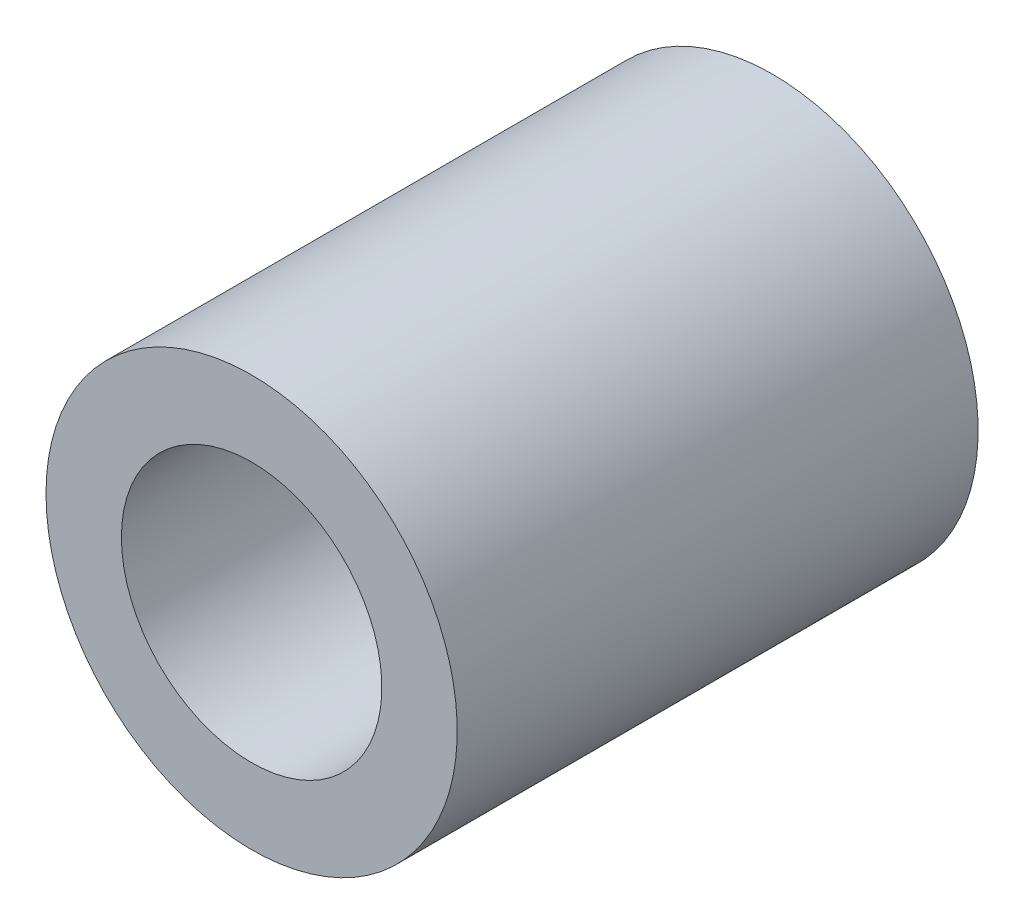
ISO-10303-21;
HEADER;
FILE_DESCRIPTION(('STEP AP214'),'2;1');
FILE_NAME('part.step','',(''),(''),'','','');
FILE_SCHEMA(('AUTOMOTIVE_DESIGN { 1 0 10303 214 1 1 1 1 }'));
ENDSEC;
DATA;
#1=APPLICATION_CONTEXT('core data for automotive mechanical design processes');
#2=APPLICATION_PROTOCOL_DEFINITION('international standard','automotive_design',2000,#1);
#3=PRODUCT_CONTEXT('',#1,'mechanical');
#4=PRODUCT('Part','Part','',(#3));
#5=PRODUCT_RELATED_PRODUCT_CATEGORY('part','',(#4));
#6=PRODUCT_DEFINITION_FORMATION('','',#4);
#7=PRODUCT_DEFINITION_CONTEXT('part definition',#1,'design');
#8=PRODUCT_DEFINITION('design','',#6,#7);
#9=PRODUCT_DEFINITION_SHAPE('','',#8);
#10=(LENGTH_UNIT() NAMED_UNIT(*) SI_UNIT(.MILLI.,.METRE.));
#11=(NAMED_UNIT(*) PLANE_ANGLE_UNIT() SI_UNIT($,.RADIAN.));
#12=(NAMED_UNIT(*) SI_UNIT($,.STERADIAN.) SOLID_ANGLE_UNIT());
#13=UNCERTAINTY_MEASURE_WITH_UNIT(LENGTH_MEASURE(1.E-05),#10,'distance_accuracy_value','');
#14=(GEOMETRIC_REPRESENTATION_CONTEXT(3) GLOBAL_UNCERTAINTY_ASSIGNED_CONTEXT((#13)) GLOBAL_UNIT_ASSIGNED_CONTEXT((#10,
#11,#12)) REPRESENTATION_CONTEXT('',''));
#15=CARTESIAN_POINT('',(0.,0.,0.));
#16=DIRECTION('',(0.,0.,1.));
#17=DIRECTION('',(1.,0.,0.));
#18=AXIS2_PLACEMENT_3D('',#15,#16,#17);
#19=CARTESIAN_POINT('',(0.,0.,7.6));
#20=DIRECTION('',(0.,0.,1.));
#21=DIRECTION('',(1.,0.,0.));
#22=AXIS2_PLACEMENT_3D('',#19,#20,#21);
#23=PLANE('',#22);
#24=CARTESIAN_POINT('',(0.,0.,7.6));
#25=DIRECTION('',(0.,0.,1.));
#26=DIRECTION('',(1.,0.,0.));
#27=AXIS2_PLACEMENT_3D('',#24,#25,#26);
#28=CIRCLE('',#27,3.);
#29=CARTESIAN_POINT('',(-3.,0.,7.6));
#30=VERTEX_POINT('',#29);
#31=EDGE_CURVE('E10',#30,#30,#28,.T.);
#32=ORIENTED_EDGE('',*,*,#31,.T.);
#33=EDGE_LOOP('',(#32));
#34=FACE_BOUND('',#33,.T.);
#35=CARTESIAN_POINT('',(0.,0.,7.6));
#36=DIRECTION('',(0.,0.,1.));
#37=DIRECTION('',(1.,0.,0.));
#38=AXIS2_PLACEMENT_3D('',#35,#36,#37);
#39=CIRCLE('',#38,1.9);
#40=CARTESIAN_POINT('',(-1.9,0.,7.6));
#41=VERTEX_POINT('',#40);
#42=EDGE_CURVE('E39',#41,#41,#39,.T.);
#43=ORIENTED_EDGE('',*,*,#42,.F.);
#44=EDGE_LOOP('',(#43));
#45=FACE_BOUND('',#44,.T.);
#46=ADVANCED_FACE('F28',(#34,#45),#23,.T.);
#47=CARTESIAN_POINT('',(0.,0.,0.));
#48=DIRECTION('',(0.,0.,1.));
#49=DIRECTION('',(1.,0.,0.));
#50=AXIS2_PLACEMENT_3D('',#47,#48,#49);
#51=PLANE('',#50);
#52=CARTESIAN_POINT('',(0.,0.,0.));
#53=DIRECTION('',(0.,0.,1.));
#54=DIRECTION('',(1.,0.,0.));
#55=AXIS2_PLACEMENT_3D('',#52,#53,#54);
#56=CIRCLE('',#55,3.);
#57=CARTESIAN_POINT('',(-3.,0.,0.));
#58=VERTEX_POINT('',#57);
#59=EDGE_CURVE('E32',#58,#58,#56,.T.);
#60=ORIENTED_EDGE('',*,*,#59,.F.);
#61=EDGE_LOOP('',(#60));
#62=FACE_BOUND('',#61,.T.);
#63=CARTESIAN_POINT('',(0.,0.,0.));
#64=DIRECTION('',(0.,0.,1.));
#65=DIRECTION('',(1.,0.,0.));
#66=AXIS2_PLACEMENT_3D('',#63,#64,#65);
#67=CIRCLE('',#66,1.9);
#68=CARTESIAN_POINT('',(-1.9,0.,0.));
#69=VERTEX_POINT('',#68);
#70=EDGE_CURVE('E41',#69,#69,#67,.T.);
#71=ORIENTED_EDGE('',*,*,#70,.T.);
#72=EDGE_LOOP('',(#71));
#73=FACE_BOUND('',#72,.T.);
#74=ADVANCED_FACE('F51',(#62,#73),#51,.F.);
#75=CARTESIAN_POINT('',(0.,0.,7.6));
#76=DIRECTION('',(0.,0.,-1.));
#77=DIRECTION('',(-1.,0.,0.));
#78=AXIS2_PLACEMENT_3D('',#75,#76,#77);
#79=CYLINDRICAL_SURFACE('',#78,3.);
#80=CARTESIAN_POINT('',(-3.,0.,7.6));
#81=CARTESIAN_POINT('',(-3.,0.,7.52083333333333));
#82=CARTESIAN_POINT('',(-3.,0.,7.44166666666667));
#83=CARTESIAN_POINT('',(-3.,0.,7.28333333333333));
#84=CARTESIAN_POINT('',(-3.,0.,7.20416666666667));
#85=CARTESIAN_POINT('',(-3.,0.,7.04583333333333));
#86=CARTESIAN_POINT('',(-3.,0.,6.96666666666667));
#87=CARTESIAN_POINT('',(-3.,0.,6.80833333333333));
#88=CARTESIAN_POINT('',(-3.,0.,6.72916666666667));
#89=CARTESIAN_POINT('',(-3.,0.,6.57083333333333));
#90=CARTESIAN_POINT('',(-3.,0.,6.49166666666667));
#91=CARTESIAN_POINT('',(-3.,0.,6.33333333333333));
#92=CARTESIAN_POINT('',(-3.,0.,6.25416666666667));
#93=CARTESIAN_POINT('',(-3.,0.,6.09583333333333));
#94=CARTESIAN_POINT('',(-3.,0.,6.01666666666667));
#95=CARTESIAN_POINT('',(-3.,0.,5.85833333333333));
#96=CARTESIAN_POINT('',(-3.,0.,5.77916666666667));
#97=CARTESIAN_POINT('',(-3.,0.,5.62083333333333));
#98=CARTESIAN_POINT('',(-3.,0.,5.54166666666667));
#99=CARTESIAN_POINT('',(-3.,0.,5.38333333333333));
#100=CARTESIAN_POINT('',(-3.,0.,5.30416666666667));
#101=CARTESIAN_POINT('',(-3.,0.,5.14583333333333));
#102=CARTESIAN_POINT('',(-3.,0.,5.06666666666667));
#103=CARTESIAN_POINT('',(-3.,0.,4.90833333333333));
#104=CARTESIAN_POINT('',(-3.,0.,4.82916666666667));
#105=CARTESIAN_POINT('',(-3.,0.,4.67083333333333));
#106=CARTESIAN_POINT('',(-3.,0.,4.59166666666667));
#107=CARTESIAN_POINT('',(-3.,0.,4.43333333333333));
#108=CARTESIAN_POINT('',(-3.,0.,4.35416666666667));
#109=CARTESIAN_POINT('',(-3.,0.,4.19583333333333));
#110=CARTESIAN_POINT('',(-3.,0.,4.11666666666667));
#111=CARTESIAN_POINT('',(-3.,0.,3.95833333333333));
#112=CARTESIAN_POINT('',(-3.,0.,3.87916666666667));
#113=CARTESIAN_POINT('',(-3.,0.,3.72083333333333));
#114=CARTESIAN_POINT('',(-3.,0.,3.64166666666667));
#115=CARTESIAN_POINT('',(-3.,0.,3.48333333333333));
#116=CARTESIAN_POINT('',(-3.,0.,3.40416666666667));
#117=CARTESIAN_POINT('',(-3.,0.,3.24583333333333));
#118=CARTESIAN_POINT('',(-3.,0.,3.16666666666667));
#119=CARTESIAN_POINT('',(-3.,0.,3.00833333333333));
#120=CARTESIAN_POINT('',(-3.,0.,2.92916666666667));
#121=CARTESIAN_POINT('',(-3.,0.,2.77083333333333));
#122=CARTESIAN_POINT('',(-3.,0.,2.69166666666667));
#123=CARTESIAN_POINT('',(-3.,0.,2.53333333333333));
#124=CARTESIAN_POINT('',(-3.,0.,2.45416666666667));
#125=CARTESIAN_POINT('',(-3.,0.,2.29583333333333));
#126=CARTESIAN_POINT('',(-3.,0.,2.21666666666667));
#127=CARTESIAN_POINT('',(-3.,0.,2.05833333333333));
#128=CARTESIAN_POINT('',(-3.,0.,1.97916666666667));
#129=CARTESIAN_POINT('',(-3.,0.,1.82083333333333));
#130=CARTESIAN_POINT('',(-3.,0.,1.74166666666667));
#131=CARTESIAN_POINT('',(-3.,0.,1.58333333333333));
#132=CARTESIAN_POINT('',(-3.,0.,1.50416666666667));
#133=CARTESIAN_POINT('',(-3.,0.,1.34583333333333));
#134=CARTESIAN_POINT('',(-3.,0.,1.26666666666667));
#135=CARTESIAN_POINT('',(-3.,0.,1.10833333333333));
#136=CARTESIAN_POINT('',(-3.,0.,1.02916666666667));
#137=CARTESIAN_POINT('',(-3.,0.,0.870833333333333));
#138=CARTESIAN_POINT('',(-3.,0.,0.791666666666667));
#139=CARTESIAN_POINT('',(-3.,0.,0.633333333333333));
#140=CARTESIAN_POINT('',(-3.,0.,0.554166666666666));
#141=CARTESIAN_POINT('',(-3.,0.,0.395833333333333));
#142=CARTESIAN_POINT('',(-3.,0.,0.316666666666667));
#143=CARTESIAN_POINT('',(-3.,0.,0.158333333333333));
#144=CARTESIAN_POINT('',(-3.,0.,0.0791666666666665));
#145=CARTESIAN_POINT('',(-3.,0.,0.));
#146=B_SPLINE_CURVE_WITH_KNOTS('',3,(#80,#81,#82,#83,#84,#85,#86,#87,#88,#89,#90,#91,#92,#93,
#94,#95,#96,#97,#98,#99,#100,#101,#102,#103,#104,#105,#106,#107,#108,#109,#110,#111,#112,#113,
#114,#115,#116,#117,#118,#119,#120,#121,#122,#123,#124,#125,#126,#127,#128,#129,#130,#131,#132,
#133,#134,#135,#136,#137,#138,#139,#140,#141,#142,#143,#144,#145),.UNSPECIFIED.,.F.,.F.,(4,2,2,
2,2,2,2,2,2,2,2,2,2,2,2,2,2,2,2,2,2,2,2,2,2,2,2,2,2,2,2,2,4),(0.,0.2375,0.475,0.7125,0.95,
1.1875,1.425,1.6625,1.9,2.1375,2.375,2.6125,2.85,3.0875,3.325,3.5625,3.8,4.0375,4.275,4.5125,
4.75,4.9875,5.225,5.4625,5.7,5.9375,6.175,6.4125,6.65,6.8875,7.125,7.3625,7.6),.UNSPECIFIED.);
#147=EDGE_CURVE('BSEAM30',#30,#58,#146,.T.);
#148=ORIENTED_EDGE('',*,*,#31,.F.);
#149=ORIENTED_EDGE('',*,*,#59,.T.);
#150=ORIENTED_EDGE('',*,*,#147,.T.);
#151=ORIENTED_EDGE('',*,*,#147,.F.);
#152=EDGE_LOOP('',(#148,#150,#149,#151));
#153=FACE_BOUND('',#152,.T.);
#154=ADVANCED_FACE('F30',(#153),#79,.T.);
#155=CARTESIAN_POINT('',(0.,0.,7.6));
#156=DIRECTION('',(0.,0.,-1.));
#157=DIRECTION('',(-1.,0.,0.));
#158=AXIS2_PLACEMENT_3D('',#155,#156,#157);
#159=CYLINDRICAL_SURFACE('',#158,1.9);
#160=CARTESIAN_POINT('',(-1.9,0.,7.6));
#161=CARTESIAN_POINT('',(-1.9,0.,7.52083333333333));
#162=CARTESIAN_POINT('',(-1.9,0.,7.44166666666667));
#163=CARTESIAN_POINT('',(-1.9,0.,7.28333333333333));
#164=CARTESIAN_POINT('',(-1.9,0.,7.20416666666667));
#165=CARTESIAN_POINT('',(-1.9,0.,7.04583333333333));
#166=CARTESIAN_POINT('',(-1.9,0.,6.96666666666667));
#167=CARTESIAN_POINT('',(-1.9,0.,6.80833333333333));
#168=CARTESIAN_POINT('',(-1.9,0.,6.72916666666667));
#169=CARTESIAN_POINT('',(-1.9,0.,6.57083333333333));
#170=CARTESIAN_POINT('',(-1.9,0.,6.49166666666667));
#171=CARTESIAN_POINT('',(-1.9,0.,6.33333333333333));
#172=CARTESIAN_POINT('',(-1.9,0.,6.25416666666667));
#173=CARTESIAN_POINT('',(-1.9,0.,6.09583333333333));
#174=CARTESIAN_POINT('',(-1.9,0.,6.01666666666667));
#175=CARTESIAN_POINT('',(-1.9,0.,5.85833333333333));
#176=CARTESIAN_POINT('',(-1.9,0.,5.77916666666667));
#177=CARTESIAN_POINT('',(-1.9,0.,5.62083333333333));
#178=CARTESIAN_POINT('',(-1.9,0.,5.54166666666667));
#179=CARTESIAN_POINT('',(-1.9,0.,5.38333333333333));
#180=CARTESIAN_POINT('',(-1.9,0.,5.30416666666667));
#181=CARTESIAN_POINT('',(-1.9,0.,5.14583333333333));
#182=CARTESIAN_POINT('',(-1.9,0.,5.06666666666667));
#183=CARTESIAN_POINT('',(-1.9,0.,4.90833333333333));
#184=CARTESIAN_POINT('',(-1.9,0.,4.82916666666667));
#185=CARTESIAN_POINT('',(-1.9,0.,4.67083333333333));
#186=CARTESIAN_POINT('',(-1.9,0.,4.59166666666667));
#187=CARTESIAN_POINT('',(-1.9,0.,4.43333333333333));
#188=CARTESIAN_POINT('',(-1.9,0.,4.35416666666667));
#189=CARTESIAN_POINT('',(-1.9,0.,4.19583333333333));
#190=CARTESIAN_POINT('',(-1.9,0.,4.11666666666667));
#191=CARTESIAN_POINT('',(-1.9,0.,3.95833333333333));
#192=CARTESIAN_POINT('',(-1.9,0.,3.87916666666667));
#193=CARTESIAN_POINT('',(-1.9,0.,3.72083333333333));
#194=CARTESIAN_POINT('',(-1.9,0.,3.64166666666667));
#195=CARTESIAN_POINT('',(-1.9,0.,3.48333333333333));
#196=CARTESIAN_POINT('',(-1.9,0.,3.40416666666667));
#197=CARTESIAN_POINT('',(-1.9,0.,3.24583333333333));
#198=CARTESIAN_POINT('',(-1.9,0.,3.16666666666667));
#199=CARTESIAN_POINT('',(-1.9,0.,3.00833333333333));
#200=CARTESIAN_POINT('',(-1.9,0.,2.92916666666667));
#201=CARTESIAN_POINT('',(-1.9,0.,2.77083333333333));
#202=CARTESIAN_POINT('',(-1.9,0.,2.69166666666667));
#203=CARTESIAN_POINT('',(-1.9,0.,2.53333333333333));
#204=CARTESIAN_POINT('',(-1.9,0.,2.45416666666667));
#205=CARTESIAN_POINT('',(-1.9,0.,2.29583333333333));
#206=CARTESIAN_POINT('',(-1.9,0.,2.21666666666667));
#207=CARTESIAN_POINT('',(-1.9,0.,2.05833333333333));
#208=CARTESIAN_POINT('',(-1.9,0.,1.97916666666667));
#209=CARTESIAN_POINT('',(-1.9,0.,1.82083333333333));
#210=CARTESIAN_POINT('',(-1.9,0.,1.74166666666667));
#211=CARTESIAN_POINT('',(-1.9,0.,1.58333333333333));
#212=CARTESIAN_POINT('',(-1.9,0.,1.50416666666667));
#213=CARTESIAN_POINT('',(-1.9,0.,1.34583333333333));
#214=CARTESIAN_POINT('',(-1.9,0.,1.26666666666667));
#215=CARTESIAN_POINT('',(-1.9,0.,1.10833333333333));
#216=CARTESIAN_POINT('',(-1.9,0.,1.02916666666667));
#217=CARTESIAN_POINT('',(-1.9,0.,0.870833333333333));
#218=CARTESIAN_POINT('',(-1.9,0.,0.791666666666667));
#219=CARTESIAN_POINT('',(-1.9,0.,0.633333333333333));
#220=CARTESIAN_POINT('',(-1.9,0.,0.554166666666666));
#221=CARTESIAN_POINT('',(-1.9,0.,0.395833333333333));
#222=CARTESIAN_POINT('',(-1.9,0.,0.316666666666667));
#223=CARTESIAN_POINT('',(-1.9,0.,0.158333333333333));
#224=CARTESIAN_POINT('',(-1.9,0.,0.0791666666666665));
#225=CARTESIAN_POINT('',(-1.9,0.,0.));
#226=B_SPLINE_CURVE_WITH_KNOTS('',3,(#160,#161,#162,#163,#164,#165,#166,#167,#168,#169,#170,
#171,#172,#173,#174,#175,#176,#177,#178,#179,#180,#181,#182,#183,#184,#185,#186,#187,#188,#189,
#190,#191,#192,#193,#194,#195,#196,#197,#198,#199,#200,#201,#202,#203,#204,#205,#206,#207,#208,
#209,#210,#211,#212,#213,#214,#215,#216,#217,#218,#219,#220,#221,#222,#223,#224,#225),
.UNSPECIFIED.,.F.,.F.,(4,2,2,2,2,2,2,2,2,2,2,2,2,2,2,2,2,2,2,2,2,2,2,2,2,2,2,2,2,2,2,2,4),(0.,
0.2375,0.475,0.7125,0.95,1.1875,1.425,1.6625,1.9,2.1375,2.375,2.6125,2.85,3.0875,3.325,3.5625,
3.8,4.0375,4.275,4.5125,4.75,4.9875,5.225,5.4625,5.7,5.9375,6.175,6.4125,6.65,6.8875,7.125,
7.3625,7.6),.UNSPECIFIED.);
#227=EDGE_CURVE('BSEAM47',#41,#69,#226,.T.);
#228=ORIENTED_EDGE('',*,*,#42,.T.);
#229=ORIENTED_EDGE('',*,*,#70,.F.);
#230=ORIENTED_EDGE('',*,*,#227,.T.);
#231=ORIENTED_EDGE('',*,*,#227,.F.);
#232=EDGE_LOOP('',(#228,#230,#229,#231));
#233=FACE_BOUND('',#232,.T.);
#234=ADVANCED_FACE('F47',(#233),#159,.F.);
#235=CLOSED_SHELL('',(#46,#74,#154,#234));
#236=MANIFOLD_SOLID_BREP('B2',#235);
#237=ADVANCED_BREP_SHAPE_REPRESENTATION('',(#18,#236),#14);
#238=SHAPE_DEFINITION_REPRESENTATION(#9,#237);
ENDSEC;
END-ISO-10303-21;
